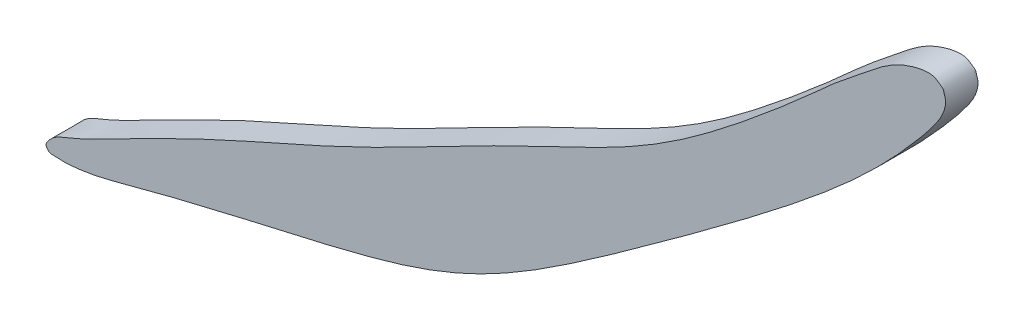
ISO-10303-21;
HEADER;
FILE_DESCRIPTION(('STEP AP214'),'2;1');
FILE_NAME('part.step','',(''),(''),'','','');
FILE_SCHEMA(('AUTOMOTIVE_DESIGN { 1 0 10303 214 1 1 1 1 }'));
ENDSEC;
DATA;
#1=APPLICATION_CONTEXT('core data for automotive mechanical design processes');
#2=APPLICATION_PROTOCOL_DEFINITION('international standard','automotive_design',2000,#1);
#3=PRODUCT_CONTEXT('',#1,'mechanical');
#4=PRODUCT('Part','Part','',(#3));
#5=PRODUCT_RELATED_PRODUCT_CATEGORY('part','',(#4));
#6=PRODUCT_DEFINITION_FORMATION('','',#4);
#7=PRODUCT_DEFINITION_CONTEXT('part definition',#1,'design');
#8=PRODUCT_DEFINITION('design','',#6,#7);
#9=PRODUCT_DEFINITION_SHAPE('','',#8);
#10=(LENGTH_UNIT() NAMED_UNIT(*) SI_UNIT(.MILLI.,.METRE.));
#11=(NAMED_UNIT(*) PLANE_ANGLE_UNIT() SI_UNIT($,.RADIAN.));
#12=(NAMED_UNIT(*) SI_UNIT($,.STERADIAN.) SOLID_ANGLE_UNIT());
#13=UNCERTAINTY_MEASURE_WITH_UNIT(LENGTH_MEASURE(1.E-05),#10,'distance_accuracy_value','');
#14=(GEOMETRIC_REPRESENTATION_CONTEXT(3) GLOBAL_UNCERTAINTY_ASSIGNED_CONTEXT((#13)) GLOBAL_UNIT_ASSIGNED_CONTEXT((#10,
#11,#12)) REPRESENTATION_CONTEXT('',''));
#15=CARTESIAN_POINT('',(0.,0.,0.));
#16=DIRECTION('',(0.,0.,1.));
#17=DIRECTION('',(1.,0.,0.));
#18=AXIS2_PLACEMENT_3D('',#15,#16,#17);
#19=CARTESIAN_POINT('',(-119.358971986514,-122.470993386579,108.));
#20=CARTESIAN_POINT('',(-119.35883030993,-122.515055537557,108.));
#21=CARTESIAN_POINT('',(-119.353968068402,-122.55543088764,108.));
#22=CARTESIAN_POINT('',(-119.337109103332,-122.637449438676,108.));
#23=CARTESIAN_POINT('',(-119.325072589776,-122.677722721752,108.));
#24=CARTESIAN_POINT('',(-119.28068304093,-122.796853086356,108.));
#25=CARTESIAN_POINT('',(-119.241212351224,-122.871410665505,108.));
#26=CARTESIAN_POINT('',(-119.152556857265,-123.014648027115,108.));
#27=CARTESIAN_POINT('',(-119.103361074938,-123.08362240416,108.));
#28=CARTESIAN_POINT('',(-119.001617449057,-123.217530727286,108.));
#29=CARTESIAN_POINT('',(-118.9491967002,-123.283091943131,108.));
#30=CARTESIAN_POINT('',(-118.838623073189,-123.409059516652,108.));
#31=CARTESIAN_POINT('',(-118.780466043218,-123.469462140634,108.));
#32=CARTESIAN_POINT('',(-118.654822031532,-123.581877037391,108.));
#33=CARTESIAN_POINT('',(-118.586821857617,-123.634638020158,108.));
#34=CARTESIAN_POINT('',(-118.369186306741,-123.762301623037,108.));
#35=CARTESIAN_POINT('',(-118.199900492788,-123.802751506419,108.));
#36=CARTESIAN_POINT('',(-117.863632926069,-123.835305232148,108.));
#37=CARTESIAN_POINT('',(-117.693465189763,-123.835044923781,108.));
#38=CARTESIAN_POINT('',(-117.354459966656,-123.843706609269,108.));
#39=CARTESIAN_POINT('',(-117.185059324994,-123.851019657864,108.));
#40=CARTESIAN_POINT('',(-116.677004729171,-123.877069396289,108.));
#41=CARTESIAN_POINT('',(-116.338657983614,-123.900717405923,108.));
#42=CARTESIAN_POINT('',(-115.661305688278,-123.936399399583,108.));
#43=CARTESIAN_POINT('',(-115.322419471787,-123.945723426132,108.));
#44=CARTESIAN_POINT('',(-114.64502172054,-123.93992130678,108.));
#45=CARTESIAN_POINT('',(-114.306241661294,-123.926807003409,108.));
#46=CARTESIAN_POINT('',(-113.291027952704,-123.867391165572,108.));
#47=CARTESIAN_POINT('',(-112.616439972198,-123.802840847514,108.));
#48=CARTESIAN_POINT('',(-110.595283542583,-123.579912055627,108.));
#49=CARTESIAN_POINT('',(-109.253927830967,-123.384378300846,108.));
#50=CARTESIAN_POINT('',(-106.589665952334,-122.879307315602,108.));
#51=CARTESIAN_POINT('',(-105.271021985163,-122.570432860896,108.));
#52=CARTESIAN_POINT('',(-102.642198963331,-121.917323577067,108.));
#53=CARTESIAN_POINT('',(-101.332374493423,-121.571538052601,108.));
#54=CARTESIAN_POINT('',(-98.7132441131514,-120.878120497034,108.));
#55=CARTESIAN_POINT('',(-97.4042119794441,-120.529400031562,108.));
#56=CARTESIAN_POINT('',(-93.4761222220374,-119.48700212952,108.));
#57=CARTESIAN_POINT('',(-90.855234312457,-118.799979077223,108.));
#58=CARTESIAN_POINT('',(-82.9761058015717,-116.804202207044,108.));
#59=CARTESIAN_POINT('',(-77.7041861742565,-115.551997703858,108.));
#60=CARTESIAN_POINT('',(-67.1464799242077,-113.106559536352,108.));
#61=CARTESIAN_POINT('',(-61.8601018925236,-111.91652953848,108.));
#62=CARTESIAN_POINT('',(-53.9403791113022,-110.088719882757,108.));
#63=CARTESIAN_POINT('',(-51.3018587112129,-109.471881457053,108.));
#64=CARTESIAN_POINT('',(-46.0368887145279,-108.198800362229,108.));
#65=CARTESIAN_POINT('',(-43.4102433933692,-107.542788577264,108.));
#66=CARTESIAN_POINT('',(-35.562646573779,-105.466924804292,108.));
#67=CARTESIAN_POINT('',(-30.3734498884304,-103.941192732593,108.));
#68=CARTESIAN_POINT('',(-24.0073921152274,-101.632450901659,108.));
#69=CARTESIAN_POINT('',(-22.7401026782932,-101.150956416458,108.));
#70=CARTESIAN_POINT('',(-20.2182731734779,-100.145457220636,108.));
#71=CARTESIAN_POINT('',(-18.9627046478944,-99.6208813938045,108.));
#72=CARTESIAN_POINT('',(-15.2312005689873,-97.987849224738,108.));
#73=CARTESIAN_POINT('',(-12.786825084828,-96.8179018461153,108.));
#74=CARTESIAN_POINT('',(-7.97634856884965,-94.3310920667657,108.));
#75=CARTESIAN_POINT('',(-5.61001864821474,-93.0146592724355,108.));
#76=CARTESIAN_POINT('',(-0.937163493005671,-90.2695449677272,108.));
#77=CARTESIAN_POINT('',(1.37081950966855,-88.8406430063104,108.));
#78=CARTESIAN_POINT('',(5.94034706016303,-85.9094950265998,108.));
#79=CARTESIAN_POINT('',(8.20015387181488,-84.4084728043644,108.));
#80=CARTESIAN_POINT('',(12.688193505858,-81.3615814736045,108.));
#81=CARTESIAN_POINT('',(14.91761530763,-79.8174011609635,108.));
#82=CARTESIAN_POINT('',(21.5820629263947,-75.1510300485795,108.));
#83=CARTESIAN_POINT('',(25.9930963715216,-71.9947610978628,108.));
#84=CARTESIAN_POINT('',(34.7856465360354,-65.6402983945943,108.));
#85=CARTESIAN_POINT('',(39.1667815441811,-62.4414564831892,108.));
#86=CARTESIAN_POINT('',(47.8947971993751,-55.9955476744095,108.));
#87=CARTESIAN_POINT('',(52.2403583928049,-52.749670749933,108.));
#88=CARTESIAN_POINT('',(60.8519183853692,-46.1590495106008,108.));
#89=CARTESIAN_POINT('',(65.1188616707817,-42.8154788518977,108.));
#90=CARTESIAN_POINT('',(73.4992664107154,-35.9376149170386,108.));
#91=CARTESIAN_POINT('',(77.6123159095963,-32.4028097284465,108.));
#92=CARTESIAN_POINT('',(83.5637705067612,-26.8295578060348,108.));
#93=CARTESIAN_POINT('',(85.506956134973,-24.9291849368957,108.));
#94=CARTESIAN_POINT('',(89.293703922965,-21.0426257316759,108.));
#95=CARTESIAN_POINT('',(91.1381831855676,-19.0547754873858,108.));
#96=CARTESIAN_POINT('',(93.8337061167965,-16.0081003630224,108.));
#97=CARTESIAN_POINT('',(94.7209340571509,-14.982259803797,108.));
#98=CARTESIAN_POINT('',(96.4734884825621,-12.9106140821065,108.));
#99=CARTESIAN_POINT('',(97.3387499575554,-11.8647496587333,108.));
#100=CARTESIAN_POINT('',(98.6034697979031,-10.2657142455033,108.));
#101=CARTESIAN_POINT('',(99.0191449643102,-9.72627747334851,108.));
#102=CARTESIAN_POINT('',(99.8248660428039,-8.62894477379711,108.));
#103=CARTESIAN_POINT('',(100.215848260204,-8.0732530836881,108.));
#104=CARTESIAN_POINT('',(100.947963661006,-6.93238688311502,108.));
#105=CARTESIAN_POINT('',(101.288775158064,-6.34702211378471,108.));
#106=CARTESIAN_POINT('',(101.733343313811,-5.42955587811499,108.));
#107=CARTESIAN_POINT('',(101.870262850737,-5.11706833612017,108.));
#108=CARTESIAN_POINT('',(102.111463837505,-4.47278971139905,108.));
#109=CARTESIAN_POINT('',(102.215212498956,-4.14496055478406,108.));
#110=CARTESIAN_POINT('',(102.380897009809,-3.48159353167752,108.));
#111=CARTESIAN_POINT('',(102.443271870933,-3.14528022636456,108.));
#112=CARTESIAN_POINT('',(102.483555062399,-2.6287583558715,108.));
#113=CARTESIAN_POINT('',(102.487683964631,-2.45547837151716,108.));
#114=CARTESIAN_POINT('',(102.471804222611,-2.11382670215672,108.));
#115=CARTESIAN_POINT('',(102.450483821322,-1.94468415057774,108.));
#116=CARTESIAN_POINT('',(102.38160185131,-1.60970021058572,108.));
#117=CARTESIAN_POINT('',(102.334039495443,-1.44360443827194,108.));
#118=CARTESIAN_POINT('',(102.228928641844,-1.11389504009587,108.));
#119=CARTESIAN_POINT('',(102.171583533051,-0.950520796991344,108.));
#120=CARTESIAN_POINT('',(102.071942065079,-0.619120851365934,108.));
#121=CARTESIAN_POINT('',(102.030585342391,-0.450804714016794,108.));
#122=CARTESIAN_POINT('',(101.957319692928,-0.201801794357223,108.));
#123=CARTESIAN_POINT('',(101.929051105426,-0.118908748789979,108.));
#124=CARTESIAN_POINT('',(101.851199569459,0.0346588118564407,108.));
#125=CARTESIAN_POINT('',(101.800653107414,0.103701195302025,108.));
#126=CARTESIAN_POINT('',(101.681788703538,0.229947075687557,108.));
#127=CARTESIAN_POINT('',(101.615794817243,0.285665203836396,108.));
#128=CARTESIAN_POINT('',(101.480185784865,0.391619974157702,108.));
#129=CARTESIAN_POINT('',(101.410577344116,0.442308487493222,108.));
#130=CARTESIAN_POINT('',(101.200007260813,0.59216022404654,108.));
#131=CARTESIAN_POINT('',(101.059105762909,0.691505023489375,108.));
#132=CARTESIAN_POINT('',(100.779437899096,0.893147560039389,108.));
#133=CARTESIAN_POINT('',(100.638501285556,0.992350749824442,108.));
#134=CARTESIAN_POINT('',(100.348719811891,1.17915254353884,108.));
#135=CARTESIAN_POINT('',(100.199910470618,1.26819885294239,108.));
#136=CARTESIAN_POINT('',(99.7417497222988,1.49952836683422,108.));
#137=CARTESIAN_POINT('',(99.4157190976692,1.59825692529581,108.));
#138=CARTESIAN_POINT('',(98.7335567748893,1.70748957480282,108.));
#139=CARTESIAN_POINT('',(98.392719901663,1.72009629290496,108.));
#140=CARTESIAN_POINT('',(97.370562016531,1.69725759524296,108.));
#141=CARTESIAN_POINT('',(96.6869777353559,1.60646342239043,108.));
#142=CARTESIAN_POINT('',(95.3522635093894,1.33619446497858,108.));
#143=CARTESIAN_POINT('',(94.694806624259,1.162712051806,108.));
#144=CARTESIAN_POINT('',(93.3945027944257,0.759156503874934,108.));
#145=CARTESIAN_POINT('',(92.7496445523645,0.526725264983024,108.));
#146=CARTESIAN_POINT('',(91.490716331959,0.0130052603753795,108.));
#147=CARTESIAN_POINT('',(90.8759418471704,-0.269116283637349,108.));
#148=CARTESIAN_POINT('',(89.076936634586,-1.19341405710289,108.));
#149=CARTESIAN_POINT('',(87.9418262288386,-1.92006181181153,108.));
#150=CARTESIAN_POINT('',(85.7428140734411,-3.49581384311458,108.));
#151=CARTESIAN_POINT('',(84.6779477312508,-4.34328417326041,108.));
#152=CARTESIAN_POINT('',(82.5680984557299,-6.05348698443028,108.));
#153=CARTESIAN_POINT('',(81.517229188699,-6.91361211555528,108.));
#154=CARTESIAN_POINT('',(79.4070574361968,-8.62341544762564,108.));
#155=CARTESIAN_POINT('',(78.3466143598835,-9.47168070368241,108.));
#156=CARTESIAN_POINT('',(76.2340696956433,-11.1785445123165,108.));
#157=CARTESIAN_POINT('',(75.1838988122735,-12.0397211590672,108.));
#158=CARTESIAN_POINT('',(73.1386501300559,-13.826773199525,108.));
#159=CARTESIAN_POINT('',(72.1435855862073,-14.7515730365784,108.));
#160=CARTESIAN_POINT('',(70.1410811376618,-16.5869197536188,108.));
#161=CARTESIAN_POINT('',(69.1285851781786,-17.4920068099047,108.));
#162=CARTESIAN_POINT('',(67.0903125162722,-19.2873143820066,108.));
#163=CARTESIAN_POINT('',(66.0676445625932,-20.1810336247634,108.));
#164=CARTESIAN_POINT('',(60.9474616871411,-24.6417780794733,108.));
#165=CARTESIAN_POINT('',(56.7959063127016,-28.1394236116584,108.));
#166=CARTESIAN_POINT('',(50.4627370207732,-33.2503710768387,108.));
#167=CARTESIAN_POINT('',(48.3338258788602,-34.9311576890824,108.));
#168=CARTESIAN_POINT('',(44.0278426080983,-38.2310618891179,108.));
#169=CARTESIAN_POINT('',(41.8509196553367,-39.8503704934225,108.));
#170=CARTESIAN_POINT('',(38.5269881875673,-42.2043652776218,108.));
#171=CARTESIAN_POINT('',(37.4093029008452,-42.9765991698287,108.));
#172=CARTESIAN_POINT('',(35.1532958977622,-44.4946424857059,108.));
#173=CARTESIAN_POINT('',(34.0142350538718,-45.240854942856,108.));
#174=CARTESIAN_POINT('',(30.5742306840077,-47.4318183948552,108.));
#175=CARTESIAN_POINT('',(28.2478522884488,-48.8297627037375,108.));
#176=CARTESIAN_POINT('',(23.531600762644,-51.5051690732649,108.));
#177=CARTESIAN_POINT('',(21.1416051150486,-52.7823986553306,108.));
#178=CARTESIAN_POINT('',(16.3151323504136,-55.2486585070683,108.));
#179=CARTESIAN_POINT('',(13.8790176033522,-56.4383763794195,108.));
#180=CARTESIAN_POINT('',(8.98995926541491,-58.785879130811,108.));
#181=CARTESIAN_POINT('',(6.53812008316203,-59.9457596424189,108.));
#182=CARTESIAN_POINT('',(1.64621320820086,-62.2878572504311,108.));
#183=CARTESIAN_POINT('',(-0.795476155045324,-63.4668734006909,108.));
#184=CARTESIAN_POINT('',(-5.66602399517185,-65.8503096023028,108.));
#185=CARTESIAN_POINT('',(-8.09462739477388,-67.0551675160712,108.));
#186=CARTESIAN_POINT('',(-12.9376316020728,-69.4928600813001,108.));
#187=CARTESIAN_POINT('',(-15.3520635679392,-70.7256333563627,108.));
#188=CARTESIAN_POINT('',(-22.5819514423566,-74.4503647513558,108.));
#189=CARTESIAN_POINT('',(-27.3827122242701,-76.9712698202689,108.));
#190=CARTESIAN_POINT('',(-34.6231621029851,-80.6751958280688,108.));
#191=CARTESIAN_POINT('',(-37.0445837405189,-81.8940646068954,108.));
#192=CARTESIAN_POINT('',(-41.9089566455027,-84.2843958684932,108.));
#193=CARTESIAN_POINT('',(-44.3516668246648,-85.4568623287511,108.));
#194=CARTESIAN_POINT('',(-49.2564841039918,-87.7599570267807,108.));
#195=CARTESIAN_POINT('',(-51.7186323685118,-88.8904964750253,108.));
#196=CARTESIAN_POINT('',(-56.6565899935273,-91.1221090467946,108.));
#197=CARTESIAN_POINT('',(-59.1323513780219,-92.2232856522383,108.));
#198=CARTESIAN_POINT('',(-66.5646949657116,-95.5159025131608,108.));
#199=CARTESIAN_POINT('',(-71.525822004866,-97.6976764467263,108.));
#200=CARTESIAN_POINT('',(-78.9084199203925,-101.097039185632,108.));
#201=CARTESIAN_POINT('',(-81.3584849005698,-102.253311153291,108.));
#202=CARTESIAN_POINT('',(-86.2388227937413,-104.60827778867,108.));
#203=CARTESIAN_POINT('',(-88.6693753742319,-105.806491995185,108.));
#204=CARTESIAN_POINT('',(-93.5160647446672,-108.231259949662,108.));
#205=CARTESIAN_POINT('',(-95.9322032685927,-109.45787063753,108.));
#206=CARTESIAN_POINT('',(-100.75756201083,-111.924700228424,108.));
#207=CARTESIAN_POINT('',(-103.166449847038,-113.165625157777,108.));
#208=CARTESIAN_POINT('',(-106.78997332207,-115.006832045381,108.));
#209=CARTESIAN_POINT('',(-108.001566681955,-115.613500671631,108.));
#210=CARTESIAN_POINT('',(-109.833773025075,-116.492601377774,108.));
#211=CARTESIAN_POINT('',(-110.44683409587,-116.780642170554,108.));
#212=CARTESIAN_POINT('',(-111.682493623787,-117.336248369035,108.));
#213=CARTESIAN_POINT('',(-112.30578316742,-117.602330112091,108.));
#214=CARTESIAN_POINT('',(-113.562208452069,-118.11335523852,108.));
#215=CARTESIAN_POINT('',(-114.193691139156,-118.36184748925,108.));
#216=CARTESIAN_POINT('',(-115.440923134348,-118.892609276612,108.));
#217=CARTESIAN_POINT('',(-116.058876786382,-119.170146406098,108.));
#218=CARTESIAN_POINT('',(-116.945724543419,-119.672503896885,108.));
#219=CARTESIAN_POINT('',(-117.235217483891,-119.85626116854,108.));
#220=CARTESIAN_POINT('',(-117.785385884798,-120.27221056085,108.));
#221=CARTESIAN_POINT('',(-118.037415386032,-120.502832936076,108.));
#222=CARTESIAN_POINT('',(-118.500488124261,-121.004340357057,108.));
#223=CARTESIAN_POINT('',(-118.714172940989,-121.27409439469,108.));
#224=CARTESIAN_POINT('',(-119.014373877911,-121.693322819306,108.));
#225=CARTESIAN_POINT('',(-119.112909223631,-121.834028587587,108.));
#226=CARTESIAN_POINT('',(-119.284090775066,-122.131717002535,108.));
#227=CARTESIAN_POINT('',(-119.359538692849,-122.294744782667,108.));
#228=CARTESIAN_POINT('',(-119.358971986514,-122.470993386579,108.));
#229=B_SPLINE_CURVE_WITH_KNOTS('',3,(#19,#20,#21,#22,#23,#24,#25,#26,#27,#28,#29,#30,#31,#32,
#33,#34,#35,#36,#37,#38,#39,#40,#41,#42,#43,#44,#45,#46,#47,#48,#49,#50,#51,#52,#53,#54,#55,#56,
#57,#58,#59,#60,#61,#62,#63,#64,#65,#66,#67,#68,#69,#70,#71,#72,#73,#74,#75,#76,#77,#78,#79,#80,
#81,#82,#83,#84,#85,#86,#87,#88,#89,#90,#91,#92,#93,#94,#95,#96,#97,#98,#99,#100,#101,#102,#103,
#104,#105,#106,#107,#108,#109,#110,#111,#112,#113,#114,#115,#116,#117,#118,#119,#120,#121,#122,
#123,#124,#125,#126,#127,#128,#129,#130,#131,#132,#133,#134,#135,#136,#137,#138,#139,#140,#141,
#142,#143,#144,#145,#146,#147,#148,#149,#150,#151,#152,#153,#154,#155,#156,#157,#158,#159,#160,
#161,#162,#163,#164,#165,#166,#167,#168,#169,#170,#171,#172,#173,#174,#175,#176,#177,#178,#179,
#180,#181,#182,#183,#184,#185,#186,#187,#188,#189,#190,#191,#192,#193,#194,#195,#196,#197,#198,
#199,#200,#201,#202,#203,#204,#205,#206,#207,#208,#209,#210,#211,#212,#213,#214,#215,#216,#217,
#218,#219,#220,#221,#222,#223,#224,#225,#226,#227,#228),.UNSPECIFIED.,.T.,.F.,(4,2,2,2,2,2,2,2,
2,2,2,2,2,2,2,2,2,2,2,2,2,2,2,2,2,2,2,2,2,2,2,2,2,2,2,2,2,2,2,2,2,2,2,2,2,2,2,2,2,2,2,2,2,2,2,2,
2,2,2,2,2,2,2,2,2,2,2,2,2,2,2,2,2,2,2,2,2,2,2,2,2,2,2,2,2,2,2,2,2,2,2,2,2,2,2,2,2,2,2,2,2,2,2,2,
4),(0.,0.000244140625,0.00048828125,0.000976562500000111,0.00146484375000011,
0.00195312500000022,0.00244140625000022,0.00292968750000033,0.00390625000000033,
0.00488281250000033,0.00585937500000022,0.00781250000000022,0.00976562500000022,
0.0117187500000002,0.0156250000000001,0.0234374999999998,0.0312499999999994,0.0390624999999992,
0.0468749999999989,0.0624999999999984,0.0937499999999973,0.124999999999996,0.140624999999996,
0.156249999999995,0.187499999999994,0.195312499999994,0.203124999999994,0.218749999999993,
0.234374999999993,0.249999999999992,0.265624999999992,0.281249999999991,0.31249999999999,
0.343749999999989,0.374999999999988,0.406249999999987,0.437499999999986,0.453124999999985,
0.468749999999985,0.476562499999984,0.484374999999984,0.488281249999984,0.492187499999984,
0.496093749999984,0.498046874999984,0.499999999999984,0.501953124999983,0.502929687499983,
0.503906249999983,0.504882812499983,0.505859374999983,0.506835937499983,0.507324218749983,
0.507812499999983,0.508300781249983,0.508789062499983,0.509765624999983,0.510742187499983,
0.511718749999983,0.513671874999983,0.515624999999983,0.519531249999983,0.523437499999983,
0.527343749999984,0.531249999999984,0.539062499999984,0.546874999999984,0.554687499999984,
0.562499999999985,0.570312499999985,0.578124999999985,0.585937499999985,0.593749999999986,
0.624999999999987,0.640624999999987,0.656249999999988,0.664062499999988,0.671874999999988,
0.687499999999989,0.703124999999989,0.71874999999999,0.73437499999999,0.749999999999991,
0.765624999999992,0.781249999999992,0.812499999999993,0.828124999999994,0.843749999999994,
0.859374999999995,0.874999999999995,0.906249999999996,0.921874999999997,0.937499999999997,
0.953124999999998,0.968749999999999,0.976562499999999,0.980468749999999,0.984374999999999,
0.988281249999999,0.9921875,0.994140625,0.99609375,0.998046875,0.9990234375,1.),.UNSPECIFIED.);
#230=DIRECTION('',(0.,0.,-1.));
#231=VECTOR('',#230,1.);
#232=SURFACE_OF_LINEAR_EXTRUSION('',#229,#231);
#233=CARTESIAN_POINT('',(-119.358971986514,-122.470993386579,108.));
#234=CARTESIAN_POINT('',(-119.359538692849,-122.294744782667,108.));
#235=CARTESIAN_POINT('',(-119.284090775066,-122.131717002535,108.));
#236=CARTESIAN_POINT('',(-119.112909223631,-121.834028587587,108.));
#237=CARTESIAN_POINT('',(-119.014373877911,-121.693322819306,108.));
#238=CARTESIAN_POINT('',(-118.714172940989,-121.27409439469,108.));
#239=CARTESIAN_POINT('',(-118.500488124261,-121.004340357057,108.));
#240=CARTESIAN_POINT('',(-118.037415386032,-120.502832936076,108.));
#241=CARTESIAN_POINT('',(-117.785385884798,-120.27221056085,108.));
#242=CARTESIAN_POINT('',(-117.235217483891,-119.85626116854,108.));
#243=CARTESIAN_POINT('',(-116.945724543419,-119.672503896885,108.));
#244=CARTESIAN_POINT('',(-116.058876786382,-119.170146406098,108.));
#245=CARTESIAN_POINT('',(-115.440923134348,-118.892609276612,108.));
#246=CARTESIAN_POINT('',(-114.193691139156,-118.36184748925,108.));
#247=CARTESIAN_POINT('',(-113.562208452069,-118.11335523852,108.));
#248=CARTESIAN_POINT('',(-112.30578316742,-117.602330112091,108.));
#249=CARTESIAN_POINT('',(-111.682493623787,-117.336248369035,108.));
#250=CARTESIAN_POINT('',(-110.44683409587,-116.780642170554,108.));
#251=CARTESIAN_POINT('',(-109.833773025075,-116.492601377774,108.));
#252=CARTESIAN_POINT('',(-108.001566681955,-115.613500671631,108.));
#253=CARTESIAN_POINT('',(-106.78997332207,-115.006832045381,108.));
#254=CARTESIAN_POINT('',(-103.166449847038,-113.165625157777,108.));
#255=CARTESIAN_POINT('',(-100.75756201083,-111.924700228424,108.));
#256=CARTESIAN_POINT('',(-95.9322032685927,-109.45787063753,108.));
#257=CARTESIAN_POINT('',(-93.5160647446672,-108.231259949662,108.));
#258=CARTESIAN_POINT('',(-88.6693753742319,-105.806491995185,108.));
#259=CARTESIAN_POINT('',(-86.2388227937413,-104.60827778867,108.));
#260=CARTESIAN_POINT('',(-81.3584849005698,-102.253311153291,108.));
#261=CARTESIAN_POINT('',(-78.9084199203925,-101.097039185632,108.));
#262=CARTESIAN_POINT('',(-71.525822004866,-97.6976764467263,108.));
#263=CARTESIAN_POINT('',(-66.5646949657116,-95.5159025131608,108.));
#264=CARTESIAN_POINT('',(-59.1323513780219,-92.2232856522383,108.));
#265=CARTESIAN_POINT('',(-56.6565899935273,-91.1221090467946,108.));
#266=CARTESIAN_POINT('',(-51.7186323685118,-88.8904964750253,108.));
#267=CARTESIAN_POINT('',(-49.2564841039918,-87.7599570267807,108.));
#268=CARTESIAN_POINT('',(-44.3516668246648,-85.4568623287511,108.));
#269=CARTESIAN_POINT('',(-41.9089566455027,-84.2843958684932,108.));
#270=CARTESIAN_POINT('',(-37.0445837405189,-81.8940646068954,108.));
#271=CARTESIAN_POINT('',(-34.6231621029851,-80.6751958280688,108.));
#272=CARTESIAN_POINT('',(-27.3827122242701,-76.9712698202689,108.));
#273=CARTESIAN_POINT('',(-22.5819514423566,-74.4503647513558,108.));
#274=CARTESIAN_POINT('',(-15.3520635679392,-70.7256333563627,108.));
#275=CARTESIAN_POINT('',(-12.9376316020728,-69.4928600813001,108.));
#276=CARTESIAN_POINT('',(-8.09462739477388,-67.0551675160712,108.));
#277=CARTESIAN_POINT('',(-5.66602399517185,-65.8503096023028,108.));
#278=CARTESIAN_POINT('',(-0.795476155045324,-63.4668734006909,108.));
#279=CARTESIAN_POINT('',(1.64621320820086,-62.2878572504311,108.));
#280=CARTESIAN_POINT('',(6.53812008316203,-59.9457596424189,108.));
#281=CARTESIAN_POINT('',(8.98995926541491,-58.785879130811,108.));
#282=CARTESIAN_POINT('',(13.8790176033522,-56.4383763794195,108.));
#283=CARTESIAN_POINT('',(16.3151323504136,-55.2486585070683,108.));
#284=CARTESIAN_POINT('',(21.1416051150486,-52.7823986553306,108.));
#285=CARTESIAN_POINT('',(23.531600762644,-51.5051690732649,108.));
#286=CARTESIAN_POINT('',(28.2478522884488,-48.8297627037375,108.));
#287=CARTESIAN_POINT('',(30.5742306840077,-47.4318183948552,108.));
#288=CARTESIAN_POINT('',(34.0142350538718,-45.240854942856,108.));
#289=CARTESIAN_POINT('',(35.1532958977622,-44.4946424857059,108.));
#290=CARTESIAN_POINT('',(37.4093029008452,-42.9765991698287,108.));
#291=CARTESIAN_POINT('',(38.5269881875673,-42.2043652776218,108.));
#292=CARTESIAN_POINT('',(41.8509196553367,-39.8503704934225,108.));
#293=CARTESIAN_POINT('',(44.0278426080983,-38.2310618891179,108.));
#294=CARTESIAN_POINT('',(48.3338258788602,-34.9311576890824,108.));
#295=CARTESIAN_POINT('',(50.4627370207732,-33.2503710768387,108.));
#296=CARTESIAN_POINT('',(56.7959063127016,-28.1394236116584,108.));
#297=CARTESIAN_POINT('',(60.9474616871411,-24.6417780794733,108.));
#298=CARTESIAN_POINT('',(66.0676445625932,-20.1810336247634,108.));
#299=CARTESIAN_POINT('',(67.0903125162722,-19.2873143820066,108.));
#300=CARTESIAN_POINT('',(69.1285851781786,-17.4920068099047,108.));
#301=CARTESIAN_POINT('',(70.1410811376618,-16.5869197536188,108.));
#302=CARTESIAN_POINT('',(72.1435855862073,-14.7515730365784,108.));
#303=CARTESIAN_POINT('',(73.1386501300559,-13.826773199525,108.));
#304=CARTESIAN_POINT('',(75.1838988122735,-12.0397211590672,108.));
#305=CARTESIAN_POINT('',(76.2340696956433,-11.1785445123165,108.));
#306=CARTESIAN_POINT('',(78.3466143598835,-9.47168070368241,108.));
#307=CARTESIAN_POINT('',(79.4070574361968,-8.62341544762564,108.));
#308=CARTESIAN_POINT('',(81.517229188699,-6.91361211555528,108.));
#309=CARTESIAN_POINT('',(82.5680984557299,-6.05348698443028,108.));
#310=CARTESIAN_POINT('',(84.6779477312508,-4.34328417326041,108.));
#311=CARTESIAN_POINT('',(85.7428140734411,-3.49581384311458,108.));
#312=CARTESIAN_POINT('',(87.9418262288386,-1.92006181181153,108.));
#313=CARTESIAN_POINT('',(89.076936634586,-1.19341405710289,108.));
#314=CARTESIAN_POINT('',(90.8759418471704,-0.269116283637349,108.));
#315=CARTESIAN_POINT('',(91.490716331959,0.0130052603753795,108.));
#316=CARTESIAN_POINT('',(92.7496445523645,0.526725264983024,108.));
#317=CARTESIAN_POINT('',(93.3945027944257,0.759156503874934,108.));
#318=CARTESIAN_POINT('',(94.694806624259,1.162712051806,108.));
#319=CARTESIAN_POINT('',(95.3522635093894,1.33619446497858,108.));
#320=CARTESIAN_POINT('',(96.6869777353559,1.60646342239043,108.));
#321=CARTESIAN_POINT('',(97.370562016531,1.69725759524296,108.));
#322=CARTESIAN_POINT('',(98.392719901663,1.72009629290496,108.));
#323=CARTESIAN_POINT('',(98.7335567748893,1.70748957480282,108.));
#324=CARTESIAN_POINT('',(99.4157190976692,1.59825692529581,108.));
#325=CARTESIAN_POINT('',(99.7417497222988,1.49952836683422,108.));
#326=CARTESIAN_POINT('',(100.199910470618,1.26819885294239,108.));
#327=CARTESIAN_POINT('',(100.348719811891,1.17915254353884,108.));
#328=CARTESIAN_POINT('',(100.638501285556,0.992350749824442,108.));
#329=CARTESIAN_POINT('',(100.779437899096,0.893147560039389,108.));
#330=CARTESIAN_POINT('',(101.059105762909,0.691505023489375,108.));
#331=CARTESIAN_POINT('',(101.200007260813,0.59216022404654,108.));
#332=CARTESIAN_POINT('',(101.410577344116,0.442308487493222,108.));
#333=CARTESIAN_POINT('',(101.480185784865,0.391619974157702,108.));
#334=CARTESIAN_POINT('',(101.615794817243,0.285665203836396,108.));
#335=CARTESIAN_POINT('',(101.681788703538,0.229947075687557,108.));
#336=CARTESIAN_POINT('',(101.800653107414,0.103701195302025,108.));
#337=CARTESIAN_POINT('',(101.851199569459,0.0346588118564407,108.));
#338=CARTESIAN_POINT('',(101.929051105426,-0.118908748789979,108.));
#339=CARTESIAN_POINT('',(101.957319692928,-0.201801794357223,108.));
#340=CARTESIAN_POINT('',(102.030585342391,-0.450804714016794,108.));
#341=CARTESIAN_POINT('',(102.071942065079,-0.619120851365934,108.));
#342=CARTESIAN_POINT('',(102.171583533051,-0.950520796991344,108.));
#343=CARTESIAN_POINT('',(102.228928641844,-1.11389504009587,108.));
#344=CARTESIAN_POINT('',(102.334039495443,-1.44360443827194,108.));
#345=CARTESIAN_POINT('',(102.38160185131,-1.60970021058572,108.));
#346=CARTESIAN_POINT('',(102.450483821322,-1.94468415057774,108.));
#347=CARTESIAN_POINT('',(102.471804222611,-2.11382670215672,108.));
#348=CARTESIAN_POINT('',(102.487683964631,-2.45547837151716,108.));
#349=CARTESIAN_POINT('',(102.483555062399,-2.6287583558715,108.));
#350=CARTESIAN_POINT('',(102.443271870933,-3.14528022636456,108.));
#351=CARTESIAN_POINT('',(102.380897009809,-3.48159353167752,108.));
#352=CARTESIAN_POINT('',(102.215212498956,-4.14496055478406,108.));
#353=CARTESIAN_POINT('',(102.111463837505,-4.47278971139905,108.));
#354=CARTESIAN_POINT('',(101.870262850737,-5.11706833612017,108.));
#355=CARTESIAN_POINT('',(101.733343313811,-5.42955587811499,108.));
#356=CARTESIAN_POINT('',(101.288775158064,-6.34702211378471,108.));
#357=CARTESIAN_POINT('',(100.947963661006,-6.93238688311502,108.));
#358=CARTESIAN_POINT('',(100.215848260204,-8.0732530836881,108.));
#359=CARTESIAN_POINT('',(99.8248660428039,-8.62894477379711,108.));
#360=CARTESIAN_POINT('',(99.0191449643102,-9.72627747334851,108.));
#361=CARTESIAN_POINT('',(98.6034697979031,-10.2657142455033,108.));
#362=CARTESIAN_POINT('',(97.3387499575554,-11.8647496587333,108.));
#363=CARTESIAN_POINT('',(96.4734884825621,-12.9106140821065,108.));
#364=CARTESIAN_POINT('',(94.7209340571509,-14.982259803797,108.));
#365=CARTESIAN_POINT('',(93.8337061167965,-16.0081003630224,108.));
#366=CARTESIAN_POINT('',(91.1381831855676,-19.0547754873858,108.));
#367=CARTESIAN_POINT('',(89.293703922965,-21.0426257316759,108.));
#368=CARTESIAN_POINT('',(85.506956134973,-24.9291849368957,108.));
#369=CARTESIAN_POINT('',(83.5637705067612,-26.8295578060348,108.));
#370=CARTESIAN_POINT('',(77.6123159095963,-32.4028097284465,108.));
#371=CARTESIAN_POINT('',(73.4992664107154,-35.9376149170386,108.));
#372=CARTESIAN_POINT('',(65.1188616707817,-42.8154788518977,108.));
#373=CARTESIAN_POINT('',(60.8519183853692,-46.1590495106008,108.));
#374=CARTESIAN_POINT('',(52.2403583928049,-52.749670749933,108.));
#375=CARTESIAN_POINT('',(47.8947971993751,-55.9955476744095,108.));
#376=CARTESIAN_POINT('',(39.1667815441811,-62.4414564831892,108.));
#377=CARTESIAN_POINT('',(34.7856465360354,-65.6402983945943,108.));
#378=CARTESIAN_POINT('',(25.9930963715216,-71.9947610978628,108.));
#379=CARTESIAN_POINT('',(21.5820629263947,-75.1510300485795,108.));
#380=CARTESIAN_POINT('',(14.91761530763,-79.8174011609635,108.));
#381=CARTESIAN_POINT('',(12.688193505858,-81.3615814736045,108.));
#382=CARTESIAN_POINT('',(8.20015387181488,-84.4084728043644,108.));
#383=CARTESIAN_POINT('',(5.94034706016303,-85.9094950265998,108.));
#384=CARTESIAN_POINT('',(1.37081950966855,-88.8406430063104,108.));
#385=CARTESIAN_POINT('',(-0.937163493005671,-90.2695449677272,108.));
#386=CARTESIAN_POINT('',(-5.61001864821474,-93.0146592724355,108.));
#387=CARTESIAN_POINT('',(-7.97634856884965,-94.3310920667657,108.));
#388=CARTESIAN_POINT('',(-12.786825084828,-96.8179018461153,108.));
#389=CARTESIAN_POINT('',(-15.2312005689873,-97.987849224738,108.));
#390=CARTESIAN_POINT('',(-18.9627046478944,-99.6208813938045,108.));
#391=CARTESIAN_POINT('',(-20.2182731734779,-100.145457220636,108.));
#392=CARTESIAN_POINT('',(-22.7401026782932,-101.150956416458,108.));
#393=CARTESIAN_POINT('',(-24.0073921152274,-101.632450901659,108.));
#394=CARTESIAN_POINT('',(-30.3734498884304,-103.941192732593,108.));
#395=CARTESIAN_POINT('',(-35.562646573779,-105.466924804292,108.));
#396=CARTESIAN_POINT('',(-43.4102433933692,-107.542788577264,108.));
#397=CARTESIAN_POINT('',(-46.0368887145279,-108.198800362229,108.));
#398=CARTESIAN_POINT('',(-51.3018587112129,-109.471881457053,108.));
#399=CARTESIAN_POINT('',(-53.9403791113022,-110.088719882757,108.));
#400=CARTESIAN_POINT('',(-61.8601018925236,-111.91652953848,108.));
#401=CARTESIAN_POINT('',(-67.1464799242077,-113.106559536352,108.));
#402=CARTESIAN_POINT('',(-77.7041861742565,-115.551997703858,108.));
#403=CARTESIAN_POINT('',(-82.9761058015717,-116.804202207044,108.));
#404=CARTESIAN_POINT('',(-90.855234312457,-118.799979077223,108.));
#405=CARTESIAN_POINT('',(-93.4761222220374,-119.48700212952,108.));
#406=CARTESIAN_POINT('',(-97.4042119794441,-120.529400031562,108.));
#407=CARTESIAN_POINT('',(-98.7132441131514,-120.878120497034,108.));
#408=CARTESIAN_POINT('',(-101.332374493423,-121.571538052601,108.));
#409=CARTESIAN_POINT('',(-102.642198963331,-121.917323577067,108.));
#410=CARTESIAN_POINT('',(-105.271021985163,-122.570432860896,108.));
#411=CARTESIAN_POINT('',(-106.589665952334,-122.879307315602,108.));
#412=CARTESIAN_POINT('',(-109.253927830967,-123.384378300846,108.));
#413=CARTESIAN_POINT('',(-110.595283542583,-123.579912055627,108.));
#414=CARTESIAN_POINT('',(-112.616439972198,-123.802840847514,108.));
#415=CARTESIAN_POINT('',(-113.291027952704,-123.867391165572,108.));
#416=CARTESIAN_POINT('',(-114.306241661294,-123.926807003409,108.));
#417=CARTESIAN_POINT('',(-114.64502172054,-123.93992130678,108.));
#418=CARTESIAN_POINT('',(-115.322419471787,-123.945723426132,108.));
#419=CARTESIAN_POINT('',(-115.661305688278,-123.936399399583,108.));
#420=CARTESIAN_POINT('',(-116.338657983614,-123.900717405923,108.));
#421=CARTESIAN_POINT('',(-116.677004729171,-123.877069396289,108.));
#422=CARTESIAN_POINT('',(-117.185059324994,-123.851019657864,108.));
#423=CARTESIAN_POINT('',(-117.354459966656,-123.843706609269,108.));
#424=CARTESIAN_POINT('',(-117.693465189763,-123.835044923781,108.));
#425=CARTESIAN_POINT('',(-117.863632926069,-123.835305232148,108.));
#426=CARTESIAN_POINT('',(-118.199900492788,-123.802751506419,108.));
#427=CARTESIAN_POINT('',(-118.369186306741,-123.762301623037,108.));
#428=CARTESIAN_POINT('',(-118.586821857617,-123.634638020158,108.));
#429=CARTESIAN_POINT('',(-118.654822031532,-123.581877037391,108.));
#430=CARTESIAN_POINT('',(-118.780466043218,-123.469462140634,108.));
#431=CARTESIAN_POINT('',(-118.838623073189,-123.409059516652,108.));
#432=CARTESIAN_POINT('',(-118.9491967002,-123.283091943131,108.));
#433=CARTESIAN_POINT('',(-119.001617449057,-123.217530727286,108.));
#434=CARTESIAN_POINT('',(-119.103361074938,-123.08362240416,108.));
#435=CARTESIAN_POINT('',(-119.152556857265,-123.014648027115,108.));
#436=CARTESIAN_POINT('',(-119.241212351224,-122.871410665505,108.));
#437=CARTESIAN_POINT('',(-119.28068304093,-122.796853086356,108.));
#438=CARTESIAN_POINT('',(-119.325072589776,-122.677722721752,108.));
#439=CARTESIAN_POINT('',(-119.337109103332,-122.637449438676,108.));
#440=CARTESIAN_POINT('',(-119.353968068402,-122.55543088764,108.));
#441=CARTESIAN_POINT('',(-119.35883030993,-122.515055537557,108.));
#442=CARTESIAN_POINT('',(-119.358971986514,-122.470993386579,108.));
#443=B_SPLINE_CURVE_WITH_KNOTS('',3,(#233,#234,#235,#236,#237,#238,#239,#240,#241,#242,#243,
#244,#245,#246,#247,#248,#249,#250,#251,#252,#253,#254,#255,#256,#257,#258,#259,#260,#261,#262,
#263,#264,#265,#266,#267,#268,#269,#270,#271,#272,#273,#274,#275,#276,#277,#278,#279,#280,#281,
#282,#283,#284,#285,#286,#287,#288,#289,#290,#291,#292,#293,#294,#295,#296,#297,#298,#299,#300,
#301,#302,#303,#304,#305,#306,#307,#308,#309,#310,#311,#312,#313,#314,#315,#316,#317,#318,#319,
#320,#321,#322,#323,#324,#325,#326,#327,#328,#329,#330,#331,#332,#333,#334,#335,#336,#337,#338,
#339,#340,#341,#342,#343,#344,#345,#346,#347,#348,#349,#350,#351,#352,#353,#354,#355,#356,#357,
#358,#359,#360,#361,#362,#363,#364,#365,#366,#367,#368,#369,#370,#371,#372,#373,#374,#375,#376,
#377,#378,#379,#380,#381,#382,#383,#384,#385,#386,#387,#388,#389,#390,#391,#392,#393,#394,#395,
#396,#397,#398,#399,#400,#401,#402,#403,#404,#405,#406,#407,#408,#409,#410,#411,#412,#413,#414,
#415,#416,#417,#418,#419,#420,#421,#422,#423,#424,#425,#426,#427,#428,#429,#430,#431,#432,#433,
#434,#435,#436,#437,#438,#439,#440,#441,#442),.UNSPECIFIED.,.T.,.F.,(4,2,2,2,2,2,2,2,2,2,2,2,2,
2,2,2,2,2,2,2,2,2,2,2,2,2,2,2,2,2,2,2,2,2,2,2,2,2,2,2,2,2,2,2,2,2,2,2,2,2,2,2,2,2,2,2,2,2,2,2,2,
2,2,2,2,2,2,2,2,2,2,2,2,2,2,2,2,2,2,2,2,2,2,2,2,2,2,2,2,2,2,2,2,2,2,2,2,2,2,2,2,2,2,2,4),(0.,
0.000976562500000111,0.00195312500000022,0.00390625000000033,0.00585937500000044,
0.00781250000000044,0.0117187500000007,0.0156250000000009,0.019531250000001,0.0234375000000012,
0.0312500000000014,0.046875000000002,0.0625000000000026,0.0781250000000031,0.0937500000000036,
0.125000000000005,0.140625000000005,0.156250000000006,0.171875000000006,0.187500000000007,
0.218750000000008,0.234375000000008,0.250000000000009,0.26562500000001,0.28125000000001,
0.296875000000011,0.312500000000011,0.328125000000012,0.335937500000012,0.343750000000012,
0.359375000000013,0.375000000000013,0.406250000000014,0.414062500000015,0.421875000000015,
0.429687500000015,0.437500000000015,0.445312500000016,0.453125000000016,0.460937500000016,
0.468750000000016,0.472656250000016,0.476562500000017,0.480468750000017,0.484375000000017,
0.486328125000017,0.488281250000017,0.489257812500017,0.490234375000017,0.491210937500017,
0.491699218750017,0.492187500000017,0.492675781250017,0.493164062500017,0.494140625000017,
0.495117187500017,0.496093750000017,0.497070312500017,0.498046875000017,0.500000000000016,
0.501953125000016,0.503906250000016,0.507812500000016,0.511718750000016,0.515625000000016,
0.523437500000016,0.531250000000015,0.546875000000015,0.562500000000014,0.593750000000013,
0.625000000000012,0.656250000000011,0.68750000000001,0.718750000000009,0.734375000000008,
0.750000000000008,0.765625000000007,0.781250000000007,0.796875000000006,0.804687500000006,
0.812500000000006,0.843750000000005,0.859375000000004,0.875000000000004,0.906250000000003,
0.937500000000002,0.953125000000001,0.960937500000001,0.968750000000001,0.9765625,0.984375,
0.98828125,0.990234375,0.9921875,0.994140625,0.9951171875,0.99609375,0.9970703125,0.99755859375,
0.998046875,0.99853515625,0.9990234375,0.99951171875,0.999755859375,1.),.UNSPECIFIED.);
#444=CARTESIAN_POINT('',(-119.358971986514,-122.470993386579,108.));
#445=VERTEX_POINT('',#444);
#446=EDGE_CURVE('E10',#445,#445,#443,.F.);
#447=ORIENTED_EDGE('',*,*,#446,.F.);
#448=EDGE_LOOP('',(#447));
#449=FACE_BOUND('',#448,.T.);
#450=CARTESIAN_POINT('',(-119.358971986514,-122.470993386579,99.9999999999997));
#451=CARTESIAN_POINT('',(-119.35883030993,-122.515055537557,99.9999999999997));
#452=CARTESIAN_POINT('',(-119.353968068402,-122.55543088764,99.9999999999997));
#453=CARTESIAN_POINT('',(-119.337109103332,-122.637449438676,99.9999999999997));
#454=CARTESIAN_POINT('',(-119.325072589776,-122.677722721752,99.9999999999997));
#455=CARTESIAN_POINT('',(-119.28068304093,-122.796853086356,99.9999999999997));
#456=CARTESIAN_POINT('',(-119.241212351224,-122.871410665505,99.9999999999997));
#457=CARTESIAN_POINT('',(-119.152556857265,-123.014648027115,99.9999999999997));
#458=CARTESIAN_POINT('',(-119.103361074938,-123.08362240416,99.9999999999997));
#459=CARTESIAN_POINT('',(-119.001617449057,-123.217530727286,99.9999999999997));
#460=CARTESIAN_POINT('',(-118.9491967002,-123.283091943131,99.9999999999997));
#461=CARTESIAN_POINT('',(-118.838623073189,-123.409059516652,99.9999999999997));
#462=CARTESIAN_POINT('',(-118.780466043218,-123.469462140634,99.9999999999997));
#463=CARTESIAN_POINT('',(-118.654822031532,-123.581877037391,99.9999999999997));
#464=CARTESIAN_POINT('',(-118.586821857617,-123.634638020158,99.9999999999997));
#465=CARTESIAN_POINT('',(-118.369186306741,-123.762301623037,99.9999999999997));
#466=CARTESIAN_POINT('',(-118.199900492788,-123.802751506419,99.9999999999997));
#467=CARTESIAN_POINT('',(-117.863632926069,-123.835305232148,99.9999999999997));
#468=CARTESIAN_POINT('',(-117.693465189763,-123.835044923781,99.9999999999997));
#469=CARTESIAN_POINT('',(-117.354459966656,-123.843706609269,99.9999999999997));
#470=CARTESIAN_POINT('',(-117.185059324994,-123.851019657864,99.9999999999997));
#471=CARTESIAN_POINT('',(-116.677004729171,-123.877069396289,99.9999999999997));
#472=CARTESIAN_POINT('',(-116.338657983614,-123.900717405923,99.9999999999997));
#473=CARTESIAN_POINT('',(-115.661305688278,-123.936399399583,99.9999999999997));
#474=CARTESIAN_POINT('',(-115.322419471787,-123.945723426132,99.9999999999997));
#475=CARTESIAN_POINT('',(-114.64502172054,-123.93992130678,99.9999999999997));
#476=CARTESIAN_POINT('',(-114.306241661294,-123.926807003409,99.9999999999997));
#477=CARTESIAN_POINT('',(-113.291027952704,-123.867391165572,99.9999999999997));
#478=CARTESIAN_POINT('',(-112.616439972198,-123.802840847514,99.9999999999997));
#479=CARTESIAN_POINT('',(-110.595283542583,-123.579912055627,99.9999999999997));
#480=CARTESIAN_POINT('',(-109.253927830967,-123.384378300846,99.9999999999997));
#481=CARTESIAN_POINT('',(-106.589665952334,-122.879307315602,99.9999999999997));
#482=CARTESIAN_POINT('',(-105.271021985163,-122.570432860896,99.9999999999997));
#483=CARTESIAN_POINT('',(-102.642198963331,-121.917323577067,99.9999999999997));
#484=CARTESIAN_POINT('',(-101.332374493423,-121.571538052601,99.9999999999997));
#485=CARTESIAN_POINT('',(-98.7132441131514,-120.878120497034,99.9999999999997));
#486=CARTESIAN_POINT('',(-97.4042119794441,-120.529400031562,99.9999999999997));
#487=CARTESIAN_POINT('',(-93.4761222220374,-119.48700212952,99.9999999999997));
#488=CARTESIAN_POINT('',(-90.855234312457,-118.799979077223,99.9999999999997));
#489=CARTESIAN_POINT('',(-82.9761058015717,-116.804202207044,99.9999999999997));
#490=CARTESIAN_POINT('',(-77.7041861742565,-115.551997703858,99.9999999999997));
#491=CARTESIAN_POINT('',(-67.1464799242077,-113.106559536352,99.9999999999997));
#492=CARTESIAN_POINT('',(-61.8601018925236,-111.91652953848,99.9999999999997));
#493=CARTESIAN_POINT('',(-53.9403791113022,-110.088719882757,99.9999999999997));
#494=CARTESIAN_POINT('',(-51.3018587112129,-109.471881457053,99.9999999999997));
#495=CARTESIAN_POINT('',(-46.0368887145279,-108.198800362229,99.9999999999997));
#496=CARTESIAN_POINT('',(-43.4102433933692,-107.542788577264,99.9999999999997));
#497=CARTESIAN_POINT('',(-35.562646573779,-105.466924804292,99.9999999999997));
#498=CARTESIAN_POINT('',(-30.3734498884304,-103.941192732593,99.9999999999997));
#499=CARTESIAN_POINT('',(-24.0073921152274,-101.632450901659,99.9999999999997));
#500=CARTESIAN_POINT('',(-22.7401026782932,-101.150956416458,99.9999999999997));
#501=CARTESIAN_POINT('',(-20.2182731734779,-100.145457220636,99.9999999999997));
#502=CARTESIAN_POINT('',(-18.9627046478944,-99.6208813938045,99.9999999999997));
#503=CARTESIAN_POINT('',(-15.2312005689873,-97.987849224738,99.9999999999997));
#504=CARTESIAN_POINT('',(-12.786825084828,-96.8179018461153,99.9999999999997));
#505=CARTESIAN_POINT('',(-7.97634856884965,-94.3310920667657,99.9999999999997));
#506=CARTESIAN_POINT('',(-5.61001864821474,-93.0146592724355,99.9999999999997));
#507=CARTESIAN_POINT('',(-0.937163493005671,-90.2695449677272,99.9999999999997));
#508=CARTESIAN_POINT('',(1.37081950966855,-88.8406430063104,99.9999999999997));
#509=CARTESIAN_POINT('',(5.94034706016303,-85.9094950265998,99.9999999999997));
#510=CARTESIAN_POINT('',(8.20015387181488,-84.4084728043644,99.9999999999997));
#511=CARTESIAN_POINT('',(12.688193505858,-81.3615814736045,99.9999999999997));
#512=CARTESIAN_POINT('',(14.91761530763,-79.8174011609635,99.9999999999997));
#513=CARTESIAN_POINT('',(21.5820629263947,-75.1510300485795,99.9999999999997));
#514=CARTESIAN_POINT('',(25.9930963715216,-71.9947610978628,99.9999999999997));
#515=CARTESIAN_POINT('',(34.7856465360354,-65.6402983945943,99.9999999999997));
#516=CARTESIAN_POINT('',(39.1667815441811,-62.4414564831892,99.9999999999997));
#517=CARTESIAN_POINT('',(47.8947971993751,-55.9955476744095,99.9999999999997));
#518=CARTESIAN_POINT('',(52.2403583928049,-52.749670749933,99.9999999999997));
#519=CARTESIAN_POINT('',(60.8519183853692,-46.1590495106008,99.9999999999997));
#520=CARTESIAN_POINT('',(65.1188616707817,-42.8154788518977,99.9999999999997));
#521=CARTESIAN_POINT('',(73.4992664107154,-35.9376149170386,99.9999999999997));
#522=CARTESIAN_POINT('',(77.6123159095963,-32.4028097284465,99.9999999999997));
#523=CARTESIAN_POINT('',(83.5637705067612,-26.8295578060348,99.9999999999997));
#524=CARTESIAN_POINT('',(85.506956134973,-24.9291849368957,99.9999999999997));
#525=CARTESIAN_POINT('',(89.293703922965,-21.0426257316759,99.9999999999997));
#526=CARTESIAN_POINT('',(91.1381831855676,-19.0547754873858,99.9999999999997));
#527=CARTESIAN_POINT('',(93.8337061167965,-16.0081003630224,99.9999999999997));
#528=CARTESIAN_POINT('',(94.7209340571509,-14.982259803797,99.9999999999997));
#529=CARTESIAN_POINT('',(96.4734884825621,-12.9106140821065,99.9999999999997));
#530=CARTESIAN_POINT('',(97.3387499575554,-11.8647496587333,99.9999999999997));
#531=CARTESIAN_POINT('',(98.6034697979031,-10.2657142455033,99.9999999999997));
#532=CARTESIAN_POINT('',(99.0191449643102,-9.72627747334851,99.9999999999997));
#533=CARTESIAN_POINT('',(99.8248660428039,-8.62894477379711,99.9999999999997));
#534=CARTESIAN_POINT('',(100.215848260204,-8.0732530836881,99.9999999999997));
#535=CARTESIAN_POINT('',(100.947963661006,-6.93238688311502,99.9999999999997));
#536=CARTESIAN_POINT('',(101.288775158064,-6.34702211378471,99.9999999999997));
#537=CARTESIAN_POINT('',(101.733343313811,-5.42955587811499,99.9999999999997));
#538=CARTESIAN_POINT('',(101.870262850737,-5.11706833612017,99.9999999999997));
#539=CARTESIAN_POINT('',(102.111463837505,-4.47278971139905,99.9999999999997));
#540=CARTESIAN_POINT('',(102.215212498956,-4.14496055478406,99.9999999999997));
#541=CARTESIAN_POINT('',(102.380897009809,-3.48159353167752,99.9999999999997));
#542=CARTESIAN_POINT('',(102.443271870933,-3.14528022636456,99.9999999999997));
#543=CARTESIAN_POINT('',(102.483555062399,-2.6287583558715,99.9999999999997));
#544=CARTESIAN_POINT('',(102.487683964631,-2.45547837151716,99.9999999999997));
#545=CARTESIAN_POINT('',(102.471804222611,-2.11382670215672,99.9999999999997));
#546=CARTESIAN_POINT('',(102.450483821322,-1.94468415057774,99.9999999999997));
#547=CARTESIAN_POINT('',(102.38160185131,-1.60970021058572,99.9999999999997));
#548=CARTESIAN_POINT('',(102.334039495443,-1.44360443827194,99.9999999999997));
#549=CARTESIAN_POINT('',(102.228928641844,-1.11389504009587,99.9999999999997));
#550=CARTESIAN_POINT('',(102.171583533051,-0.950520796991344,99.9999999999997));
#551=CARTESIAN_POINT('',(102.071942065079,-0.619120851365934,99.9999999999997));
#552=CARTESIAN_POINT('',(102.030585342391,-0.450804714016794,99.9999999999997));
#553=CARTESIAN_POINT('',(101.957319692928,-0.201801794357223,99.9999999999997));
#554=CARTESIAN_POINT('',(101.929051105426,-0.118908748789979,99.9999999999997));
#555=CARTESIAN_POINT('',(101.851199569459,0.0346588118564407,99.9999999999997));
#556=CARTESIAN_POINT('',(101.800653107414,0.103701195302025,99.9999999999997));
#557=CARTESIAN_POINT('',(101.681788703538,0.229947075687557,99.9999999999997));
#558=CARTESIAN_POINT('',(101.615794817243,0.285665203836396,99.9999999999997));
#559=CARTESIAN_POINT('',(101.480185784865,0.391619974157702,99.9999999999997));
#560=CARTESIAN_POINT('',(101.410577344116,0.442308487493222,99.9999999999997));
#561=CARTESIAN_POINT('',(101.200007260813,0.59216022404654,99.9999999999997));
#562=CARTESIAN_POINT('',(101.059105762909,0.691505023489375,99.9999999999997));
#563=CARTESIAN_POINT('',(100.779437899096,0.893147560039389,99.9999999999997));
#564=CARTESIAN_POINT('',(100.638501285556,0.992350749824442,99.9999999999997));
#565=CARTESIAN_POINT('',(100.348719811891,1.17915254353884,99.9999999999997));
#566=CARTESIAN_POINT('',(100.199910470618,1.26819885294239,99.9999999999997));
#567=CARTESIAN_POINT('',(99.7417497222988,1.49952836683422,99.9999999999997));
#568=CARTESIAN_POINT('',(99.4157190976692,1.59825692529581,99.9999999999997));
#569=CARTESIAN_POINT('',(98.7335567748893,1.70748957480282,99.9999999999997));
#570=CARTESIAN_POINT('',(98.392719901663,1.72009629290496,99.9999999999997));
#571=CARTESIAN_POINT('',(97.370562016531,1.69725759524296,99.9999999999997));
#572=CARTESIAN_POINT('',(96.6869777353559,1.60646342239043,99.9999999999997));
#573=CARTESIAN_POINT('',(95.3522635093894,1.33619446497858,99.9999999999997));
#574=CARTESIAN_POINT('',(94.694806624259,1.162712051806,99.9999999999997));
#575=CARTESIAN_POINT('',(93.3945027944257,0.759156503874934,99.9999999999997));
#576=CARTESIAN_POINT('',(92.7496445523645,0.526725264983024,99.9999999999997));
#577=CARTESIAN_POINT('',(91.490716331959,0.0130052603753795,99.9999999999997));
#578=CARTESIAN_POINT('',(90.8759418471704,-0.269116283637349,99.9999999999997));
#579=CARTESIAN_POINT('',(89.076936634586,-1.19341405710289,99.9999999999997));
#580=CARTESIAN_POINT('',(87.9418262288386,-1.92006181181153,99.9999999999997));
#581=CARTESIAN_POINT('',(85.7428140734411,-3.49581384311458,99.9999999999997));
#582=CARTESIAN_POINT('',(84.6779477312508,-4.34328417326041,99.9999999999997));
#583=CARTESIAN_POINT('',(82.5680984557299,-6.05348698443028,99.9999999999997));
#584=CARTESIAN_POINT('',(81.517229188699,-6.91361211555528,99.9999999999997));
#585=CARTESIAN_POINT('',(79.4070574361968,-8.62341544762564,99.9999999999997));
#586=CARTESIAN_POINT('',(78.3466143598835,-9.47168070368241,99.9999999999997));
#587=CARTESIAN_POINT('',(76.2340696956433,-11.1785445123165,99.9999999999997));
#588=CARTESIAN_POINT('',(75.1838988122735,-12.0397211590672,99.9999999999997));
#589=CARTESIAN_POINT('',(73.1386501300559,-13.826773199525,99.9999999999997));
#590=CARTESIAN_POINT('',(72.1435855862073,-14.7515730365784,99.9999999999997));
#591=CARTESIAN_POINT('',(70.1410811376618,-16.5869197536188,99.9999999999997));
#592=CARTESIAN_POINT('',(69.1285851781786,-17.4920068099047,99.9999999999997));
#593=CARTESIAN_POINT('',(67.0903125162722,-19.2873143820066,99.9999999999997));
#594=CARTESIAN_POINT('',(66.0676445625932,-20.1810336247634,99.9999999999997));
#595=CARTESIAN_POINT('',(60.9474616871411,-24.6417780794733,99.9999999999997));
#596=CARTESIAN_POINT('',(56.7959063127016,-28.1394236116584,99.9999999999997));
#597=CARTESIAN_POINT('',(50.4627370207732,-33.2503710768387,99.9999999999997));
#598=CARTESIAN_POINT('',(48.3338258788602,-34.9311576890824,99.9999999999997));
#599=CARTESIAN_POINT('',(44.0278426080983,-38.2310618891179,99.9999999999997));
#600=CARTESIAN_POINT('',(41.8509196553367,-39.8503704934225,99.9999999999997));
#601=CARTESIAN_POINT('',(38.5269881875673,-42.2043652776218,99.9999999999997));
#602=CARTESIAN_POINT('',(37.4093029008452,-42.9765991698287,99.9999999999997));
#603=CARTESIAN_POINT('',(35.1532958977622,-44.4946424857059,99.9999999999997));
#604=CARTESIAN_POINT('',(34.0142350538718,-45.240854942856,99.9999999999997));
#605=CARTESIAN_POINT('',(30.5742306840077,-47.4318183948552,99.9999999999997));
#606=CARTESIAN_POINT('',(28.2478522884488,-48.8297627037375,99.9999999999997));
#607=CARTESIAN_POINT('',(23.531600762644,-51.5051690732649,99.9999999999997));
#608=CARTESIAN_POINT('',(21.1416051150486,-52.7823986553306,99.9999999999997));
#609=CARTESIAN_POINT('',(16.3151323504136,-55.2486585070683,99.9999999999997));
#610=CARTESIAN_POINT('',(13.8790176033522,-56.4383763794195,99.9999999999997));
#611=CARTESIAN_POINT('',(8.98995926541491,-58.785879130811,99.9999999999997));
#612=CARTESIAN_POINT('',(6.53812008316203,-59.9457596424189,99.9999999999997));
#613=CARTESIAN_POINT('',(1.64621320820086,-62.2878572504311,99.9999999999997));
#614=CARTESIAN_POINT('',(-0.795476155045324,-63.4668734006909,99.9999999999997));
#615=CARTESIAN_POINT('',(-5.66602399517185,-65.8503096023028,99.9999999999997));
#616=CARTESIAN_POINT('',(-8.09462739477388,-67.0551675160712,99.9999999999997));
#617=CARTESIAN_POINT('',(-12.9376316020728,-69.4928600813001,99.9999999999997));
#618=CARTESIAN_POINT('',(-15.3520635679392,-70.7256333563627,99.9999999999997));
#619=CARTESIAN_POINT('',(-22.5819514423566,-74.4503647513558,99.9999999999997));
#620=CARTESIAN_POINT('',(-27.3827122242701,-76.9712698202689,99.9999999999997));
#621=CARTESIAN_POINT('',(-34.6231621029851,-80.6751958280688,99.9999999999997));
#622=CARTESIAN_POINT('',(-37.0445837405189,-81.8940646068954,99.9999999999997));
#623=CARTESIAN_POINT('',(-41.9089566455027,-84.2843958684932,99.9999999999997));
#624=CARTESIAN_POINT('',(-44.3516668246648,-85.4568623287511,99.9999999999997));
#625=CARTESIAN_POINT('',(-49.2564841039918,-87.7599570267807,99.9999999999997));
#626=CARTESIAN_POINT('',(-51.7186323685118,-88.8904964750253,99.9999999999997));
#627=CARTESIAN_POINT('',(-56.6565899935273,-91.1221090467946,99.9999999999997));
#628=CARTESIAN_POINT('',(-59.1323513780219,-92.2232856522383,99.9999999999997));
#629=CARTESIAN_POINT('',(-66.5646949657116,-95.5159025131608,99.9999999999997));
#630=CARTESIAN_POINT('',(-71.525822004866,-97.6976764467263,99.9999999999997));
#631=CARTESIAN_POINT('',(-78.9084199203925,-101.097039185632,99.9999999999997));
#632=CARTESIAN_POINT('',(-81.3584849005698,-102.253311153291,99.9999999999997));
#633=CARTESIAN_POINT('',(-86.2388227937413,-104.60827778867,99.9999999999997));
#634=CARTESIAN_POINT('',(-88.6693753742319,-105.806491995185,99.9999999999997));
#635=CARTESIAN_POINT('',(-93.5160647446672,-108.231259949662,99.9999999999997));
#636=CARTESIAN_POINT('',(-95.9322032685927,-109.45787063753,99.9999999999997));
#637=CARTESIAN_POINT('',(-100.75756201083,-111.924700228424,99.9999999999997));
#638=CARTESIAN_POINT('',(-103.166449847038,-113.165625157777,99.9999999999997));
#639=CARTESIAN_POINT('',(-106.78997332207,-115.006832045381,99.9999999999997));
#640=CARTESIAN_POINT('',(-108.001566681955,-115.613500671631,99.9999999999997));
#641=CARTESIAN_POINT('',(-109.833773025075,-116.492601377774,99.9999999999997));
#642=CARTESIAN_POINT('',(-110.44683409587,-116.780642170554,99.9999999999997));
#643=CARTESIAN_POINT('',(-111.682493623787,-117.336248369035,99.9999999999997));
#644=CARTESIAN_POINT('',(-112.30578316742,-117.602330112091,99.9999999999997));
#645=CARTESIAN_POINT('',(-113.562208452069,-118.11335523852,99.9999999999997));
#646=CARTESIAN_POINT('',(-114.193691139156,-118.36184748925,99.9999999999997));
#647=CARTESIAN_POINT('',(-115.440923134348,-118.892609276612,99.9999999999997));
#648=CARTESIAN_POINT('',(-116.058876786382,-119.170146406098,99.9999999999997));
#649=CARTESIAN_POINT('',(-116.945724543419,-119.672503896885,99.9999999999997));
#650=CARTESIAN_POINT('',(-117.235217483891,-119.85626116854,99.9999999999997));
#651=CARTESIAN_POINT('',(-117.785385884798,-120.27221056085,99.9999999999997));
#652=CARTESIAN_POINT('',(-118.037415386032,-120.502832936076,99.9999999999997));
#653=CARTESIAN_POINT('',(-118.500488124261,-121.004340357057,99.9999999999997));
#654=CARTESIAN_POINT('',(-118.714172940989,-121.27409439469,99.9999999999997));
#655=CARTESIAN_POINT('',(-119.014373877911,-121.693322819306,99.9999999999997));
#656=CARTESIAN_POINT('',(-119.112909223631,-121.834028587587,99.9999999999997));
#657=CARTESIAN_POINT('',(-119.284090775066,-122.131717002535,99.9999999999997));
#658=CARTESIAN_POINT('',(-119.359538692849,-122.294744782667,99.9999999999997));
#659=CARTESIAN_POINT('',(-119.358971986514,-122.470993386579,99.9999999999997));
#660=B_SPLINE_CURVE_WITH_KNOTS('',3,(#450,#451,#452,#453,#454,#455,#456,#457,#458,#459,#460,
#461,#462,#463,#464,#465,#466,#467,#468,#469,#470,#471,#472,#473,#474,#475,#476,#477,#478,#479,
#480,#481,#482,#483,#484,#485,#486,#487,#488,#489,#490,#491,#492,#493,#494,#495,#496,#497,#498,
#499,#500,#501,#502,#503,#504,#505,#506,#507,#508,#509,#510,#511,#512,#513,#514,#515,#516,#517,
#518,#519,#520,#521,#522,#523,#524,#525,#526,#527,#528,#529,#530,#531,#532,#533,#534,#535,#536,
#537,#538,#539,#540,#541,#542,#543,#544,#545,#546,#547,#548,#549,#550,#551,#552,#553,#554,#555,
#556,#557,#558,#559,#560,#561,#562,#563,#564,#565,#566,#567,#568,#569,#570,#571,#572,#573,#574,
#575,#576,#577,#578,#579,#580,#581,#582,#583,#584,#585,#586,#587,#588,#589,#590,#591,#592,#593,
#594,#595,#596,#597,#598,#599,#600,#601,#602,#603,#604,#605,#606,#607,#608,#609,#610,#611,#612,
#613,#614,#615,#616,#617,#618,#619,#620,#621,#622,#623,#624,#625,#626,#627,#628,#629,#630,#631,
#632,#633,#634,#635,#636,#637,#638,#639,#640,#641,#642,#643,#644,#645,#646,#647,#648,#649,#650,
#651,#652,#653,#654,#655,#656,#657,#658,#659),.UNSPECIFIED.,.T.,.F.,(4,2,2,2,2,2,2,2,2,2,2,2,2,
2,2,2,2,2,2,2,2,2,2,2,2,2,2,2,2,2,2,2,2,2,2,2,2,2,2,2,2,2,2,2,2,2,2,2,2,2,2,2,2,2,2,2,2,2,2,2,2,
2,2,2,2,2,2,2,2,2,2,2,2,2,2,2,2,2,2,2,2,2,2,2,2,2,2,2,2,2,2,2,2,2,2,2,2,2,2,2,2,2,2,2,4),(0.,
0.000244140625,0.00048828125,0.000976562500000111,0.00146484375000011,0.00195312500000022,
0.00244140625000022,0.00292968750000033,0.00390625000000033,0.00488281250000033,
0.00585937500000022,0.00781250000000022,0.00976562500000022,0.0117187500000002,
0.0156250000000001,0.0234374999999998,0.0312499999999994,0.0390624999999992,0.0468749999999989,
0.0624999999999984,0.0937499999999973,0.124999999999996,0.140624999999996,0.156249999999995,
0.187499999999994,0.195312499999994,0.203124999999994,0.218749999999993,0.234374999999993,
0.249999999999992,0.265624999999992,0.281249999999991,0.31249999999999,0.343749999999989,
0.374999999999988,0.406249999999987,0.437499999999986,0.453124999999985,0.468749999999985,
0.476562499999984,0.484374999999984,0.488281249999984,0.492187499999984,0.496093749999984,
0.498046874999984,0.499999999999984,0.501953124999983,0.502929687499983,0.503906249999983,
0.504882812499983,0.505859374999983,0.506835937499983,0.507324218749983,0.507812499999983,
0.508300781249983,0.508789062499983,0.509765624999983,0.510742187499983,0.511718749999983,
0.513671874999983,0.515624999999983,0.519531249999983,0.523437499999983,0.527343749999984,
0.531249999999984,0.539062499999984,0.546874999999984,0.554687499999984,0.562499999999985,
0.570312499999985,0.578124999999985,0.585937499999985,0.593749999999986,0.624999999999987,
0.640624999999987,0.656249999999988,0.664062499999988,0.671874999999988,0.687499999999989,
0.703124999999989,0.71874999999999,0.73437499999999,0.749999999999991,0.765624999999992,
0.781249999999992,0.812499999999993,0.828124999999994,0.843749999999994,0.859374999999995,
0.874999999999995,0.906249999999996,0.921874999999997,0.937499999999997,0.953124999999998,
0.968749999999999,0.976562499999999,0.980468749999999,0.984374999999999,0.988281249999999,
0.9921875,0.994140625,0.99609375,0.998046875,0.9990234375,1.),.UNSPECIFIED.);
#661=CARTESIAN_POINT('',(-119.358971986514,-122.470993386579,99.9999999999997));
#662=VERTEX_POINT('',#661);
#663=EDGE_CURVE('E38',#662,#662,#660,.T.);
#664=ORIENTED_EDGE('',*,*,#663,.T.);
#665=EDGE_LOOP('',(#664));
#666=FACE_BOUND('',#665,.T.);
#667=ADVANCED_FACE('F28',(#449,#666),#232,.F.);
#668=CARTESIAN_POINT('',(102.298054754384,-3.81327704322241,108.));
#669=DIRECTION('',(0.,0.,1.));
#670=DIRECTION('',(1.,0.,0.));
#671=AXIS2_PLACEMENT_3D('',#668,#669,#670);
#672=PLANE('',#671);
#673=ORIENTED_EDGE('',*,*,#446,.T.);
#674=EDGE_LOOP('',(#673));
#675=FACE_BOUND('',#674,.T.);
#676=ADVANCED_FACE('F69',(#675),#672,.T.);
#677=CARTESIAN_POINT('',(102.298054754384,-3.81327704322241,99.9999999999997));
#678=DIRECTION('',(0.,0.,1.));
#679=DIRECTION('',(1.,0.,0.));
#680=AXIS2_PLACEMENT_3D('',#677,#678,#679);
#681=PLANE('',#680);
#682=ORIENTED_EDGE('',*,*,#663,.F.);
#683=EDGE_LOOP('',(#682));
#684=FACE_BOUND('',#683,.T.);
#685=ADVANCED_FACE('F77',(#684),#681,.F.);
#686=CLOSED_SHELL('',(#667,#676,#685));
#687=MANIFOLD_SOLID_BREP('B2',#686);
#688=ADVANCED_BREP_SHAPE_REPRESENTATION('',(#18,#687),#14);
#689=SHAPE_DEFINITION_REPRESENTATION(#9,#688);
ENDSEC;
END-ISO-10303-21;
